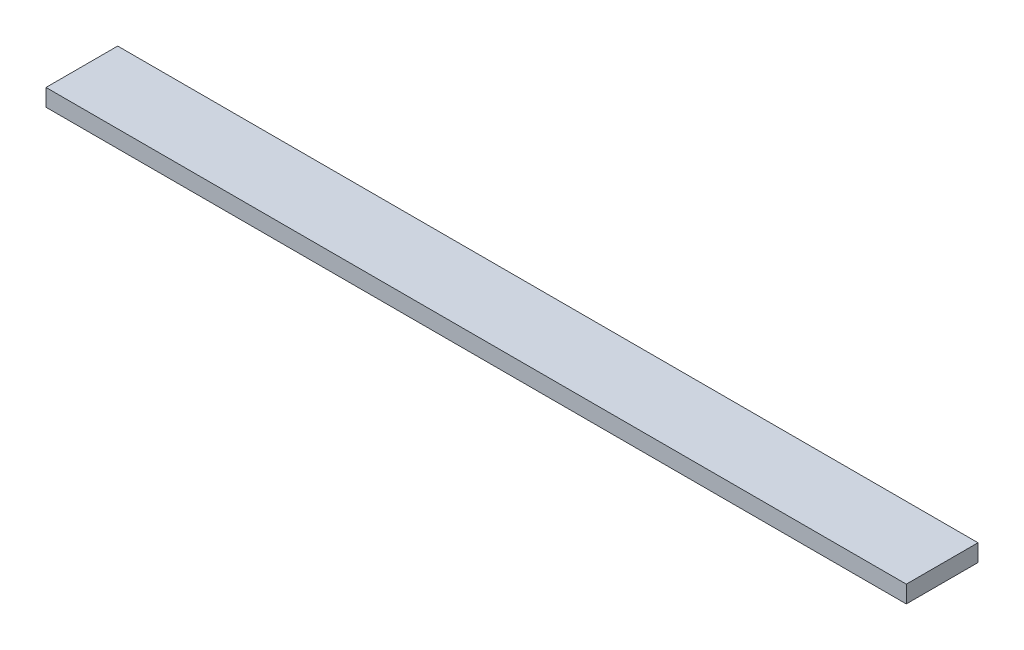
ISO-10303-21;
HEADER;
FILE_DESCRIPTION(('STEP AP214'),'2;1');
FILE_NAME('part.step','',(''),(''),'','','');
FILE_SCHEMA(('AUTOMOTIVE_DESIGN { 1 0 10303 214 1 1 1 1 }'));
ENDSEC;
DATA;
#1=APPLICATION_CONTEXT('core data for automotive mechanical design processes');
#2=APPLICATION_PROTOCOL_DEFINITION('international standard','automotive_design',2000,#1);
#3=PRODUCT_CONTEXT('',#1,'mechanical');
#4=PRODUCT('Part','Part','',(#3));
#5=PRODUCT_RELATED_PRODUCT_CATEGORY('part','',(#4));
#6=PRODUCT_DEFINITION_FORMATION('','',#4);
#7=PRODUCT_DEFINITION_CONTEXT('part definition',#1,'design');
#8=PRODUCT_DEFINITION('design','',#6,#7);
#9=PRODUCT_DEFINITION_SHAPE('','',#8);
#10=(LENGTH_UNIT() NAMED_UNIT(*) SI_UNIT(.MILLI.,.METRE.));
#11=(NAMED_UNIT(*) PLANE_ANGLE_UNIT() SI_UNIT($,.RADIAN.));
#12=(NAMED_UNIT(*) SI_UNIT($,.STERADIAN.) SOLID_ANGLE_UNIT());
#13=UNCERTAINTY_MEASURE_WITH_UNIT(LENGTH_MEASURE(1.E-05),#10,'distance_accuracy_value','');
#14=(GEOMETRIC_REPRESENTATION_CONTEXT(3) GLOBAL_UNCERTAINTY_ASSIGNED_CONTEXT((#13)) GLOBAL_UNIT_ASSIGNED_CONTEXT((#10,
#11,#12)) REPRESENTATION_CONTEXT('',''));
#15=CARTESIAN_POINT('',(0.,0.,0.));
#16=DIRECTION('',(0.,0.,1.));
#17=DIRECTION('',(1.,0.,0.));
#18=AXIS2_PLACEMENT_3D('',#15,#16,#17);
#19=CARTESIAN_POINT('',(457.2,18.25625,38.1));
#20=DIRECTION('',(-1.,0.,0.));
#21=DIRECTION('',(0.,0.,1.));
#22=AXIS2_PLACEMENT_3D('',#19,#20,#21);
#23=PLANE('',#22);
#24=DIRECTION('',(0.,0.,-1.));
#25=VECTOR('',#24,1.);
#26=CARTESIAN_POINT('',(457.2,0.,38.1));
#27=LINE('',#26,#25);
#28=CARTESIAN_POINT('',(457.2,0.,38.1));
#29=VERTEX_POINT('',#28);
#30=CARTESIAN_POINT('',(457.2,0.,-38.1));
#31=VERTEX_POINT('',#30);
#32=EDGE_CURVE('E107',#29,#31,#27,.T.);
#33=ORIENTED_EDGE('',*,*,#32,.T.);
#34=DIRECTION('',(0.,-1.,0.));
#35=VECTOR('',#34,1.);
#36=CARTESIAN_POINT('',(457.2,18.25625,-38.1));
#37=LINE('',#36,#35);
#38=CARTESIAN_POINT('',(457.2,18.25625,-38.1));
#39=VERTEX_POINT('',#38);
#40=EDGE_CURVE('E11',#39,#31,#37,.T.);
#41=ORIENTED_EDGE('',*,*,#40,.F.);
#42=DIRECTION('',(0.,0.,-1.));
#43=VECTOR('',#42,1.);
#44=CARTESIAN_POINT('',(457.2,18.25625,38.1));
#45=LINE('',#44,#43);
#46=CARTESIAN_POINT('',(457.2,18.25625,38.1));
#47=VERTEX_POINT('',#46);
#48=EDGE_CURVE('E91',#47,#39,#45,.T.);
#49=ORIENTED_EDGE('',*,*,#48,.F.);
#50=DIRECTION('',(0.,-1.,0.));
#51=VECTOR('',#50,1.);
#52=CARTESIAN_POINT('',(457.2,18.25625,38.1));
#53=LINE('',#52,#51);
#54=EDGE_CURVE('E103',#47,#29,#53,.T.);
#55=ORIENTED_EDGE('',*,*,#54,.T.);
#56=EDGE_LOOP('',(#33,#41,#49,#55));
#57=FACE_BOUND('',#56,.T.);
#58=ADVANCED_FACE('F39',(#57),#23,.F.);
#59=CARTESIAN_POINT('',(-457.2,18.25625,-38.1));
#60=DIRECTION('',(0.,0.,1.));
#61=DIRECTION('',(1.,0.,0.));
#62=AXIS2_PLACEMENT_3D('',#59,#60,#61);
#63=PLANE('',#62);
#64=DIRECTION('',(-1.,0.,0.));
#65=VECTOR('',#64,1.);
#66=CARTESIAN_POINT('',(-457.2,0.,-38.1));
#67=LINE('',#66,#65);
#68=CARTESIAN_POINT('',(-457.2,0.,-38.1));
#69=VERTEX_POINT('',#68);
#70=EDGE_CURVE('E96',#31,#69,#67,.T.);
#71=ORIENTED_EDGE('',*,*,#70,.T.);
#72=DIRECTION('',(0.,-1.,0.));
#73=VECTOR('',#72,1.);
#74=CARTESIAN_POINT('',(-457.2,18.25625,-38.1));
#75=LINE('',#74,#73);
#76=CARTESIAN_POINT('',(-457.2,18.25625,-38.1));
#77=VERTEX_POINT('',#76);
#78=EDGE_CURVE('E48',#77,#69,#75,.T.);
#79=ORIENTED_EDGE('',*,*,#78,.F.);
#80=DIRECTION('',(-1.,0.,0.));
#81=VECTOR('',#80,1.);
#82=CARTESIAN_POINT('',(-457.2,18.25625,-38.1));
#83=LINE('',#82,#81);
#84=EDGE_CURVE('E86',#39,#77,#83,.T.);
#85=ORIENTED_EDGE('',*,*,#84,.F.);
#86=ORIENTED_EDGE('',*,*,#40,.T.);
#87=EDGE_LOOP('',(#71,#79,#85,#86));
#88=FACE_BOUND('',#87,.T.);
#89=ADVANCED_FACE('F95',(#88),#63,.F.);
#90=CARTESIAN_POINT('',(-457.2,18.25625,38.1));
#91=DIRECTION('',(1.,0.,0.));
#92=DIRECTION('',(0.,0.,-1.));
#93=AXIS2_PLACEMENT_3D('',#90,#91,#92);
#94=PLANE('',#93);
#95=DIRECTION('',(0.,0.,1.));
#96=VECTOR('',#95,1.);
#97=CARTESIAN_POINT('',(-457.2,0.,38.1));
#98=LINE('',#97,#96);
#99=CARTESIAN_POINT('',(-457.2,0.,38.1));
#100=VERTEX_POINT('',#99);
#101=EDGE_CURVE('E73',#69,#100,#98,.T.);
#102=ORIENTED_EDGE('',*,*,#101,.T.);
#103=DIRECTION('',(0.,-1.,0.));
#104=VECTOR('',#103,1.);
#105=CARTESIAN_POINT('',(-457.2,18.25625,38.1));
#106=LINE('',#105,#104);
#107=CARTESIAN_POINT('',(-457.2,18.25625,38.1));
#108=VERTEX_POINT('',#107);
#109=EDGE_CURVE('E98',#108,#100,#106,.T.);
#110=ORIENTED_EDGE('',*,*,#109,.F.);
#111=DIRECTION('',(0.,0.,1.));
#112=VECTOR('',#111,1.);
#113=CARTESIAN_POINT('',(-457.2,18.25625,38.1));
#114=LINE('',#113,#112);
#115=EDGE_CURVE('E89',#77,#108,#114,.T.);
#116=ORIENTED_EDGE('',*,*,#115,.F.);
#117=ORIENTED_EDGE('',*,*,#78,.T.);
#118=EDGE_LOOP('',(#102,#110,#116,#117));
#119=FACE_BOUND('',#118,.T.);
#120=ADVANCED_FACE('F99',(#119),#94,.F.);
#121=CARTESIAN_POINT('',(-457.2,18.25625,38.1));
#122=DIRECTION('',(0.,0.,-1.));
#123=DIRECTION('',(-1.,0.,0.));
#124=AXIS2_PLACEMENT_3D('',#121,#122,#123);
#125=PLANE('',#124);
#126=DIRECTION('',(1.,0.,0.));
#127=VECTOR('',#126,1.);
#128=CARTESIAN_POINT('',(-457.2,0.,38.1));
#129=LINE('',#128,#127);
#130=EDGE_CURVE('E79',#100,#29,#129,.T.);
#131=ORIENTED_EDGE('',*,*,#130,.T.);
#132=ORIENTED_EDGE('',*,*,#54,.F.);
#133=DIRECTION('',(1.,0.,0.));
#134=VECTOR('',#133,1.);
#135=CARTESIAN_POINT('',(-457.2,18.25625,38.1));
#136=LINE('',#135,#134);
#137=EDGE_CURVE('E56',#108,#47,#136,.T.);
#138=ORIENTED_EDGE('',*,*,#137,.F.);
#139=ORIENTED_EDGE('',*,*,#109,.T.);
#140=EDGE_LOOP('',(#131,#132,#138,#139));
#141=FACE_BOUND('',#140,.T.);
#142=ADVANCED_FACE('F120',(#141),#125,.F.);
#143=CARTESIAN_POINT('',(0.,18.25625,0.));
#144=DIRECTION('',(0.,-1.,0.));
#145=DIRECTION('',(0.,0.,-1.));
#146=AXIS2_PLACEMENT_3D('',#143,#144,#145);
#147=PLANE('',#146);
#148=ORIENTED_EDGE('',*,*,#48,.T.);
#149=ORIENTED_EDGE('',*,*,#84,.T.);
#150=ORIENTED_EDGE('',*,*,#115,.T.);
#151=ORIENTED_EDGE('',*,*,#137,.T.);
#152=EDGE_LOOP('',(#148,#149,#150,#151));
#153=FACE_BOUND('',#152,.T.);
#154=ADVANCED_FACE('F87',(#153),#147,.F.);
#155=CARTESIAN_POINT('',(0.,0.,0.));
#156=DIRECTION('',(0.,-1.,0.));
#157=DIRECTION('',(0.,0.,-1.));
#158=AXIS2_PLACEMENT_3D('',#155,#156,#157);
#159=PLANE('',#158);
#160=ORIENTED_EDGE('',*,*,#32,.F.);
#161=ORIENTED_EDGE('',*,*,#130,.F.);
#162=ORIENTED_EDGE('',*,*,#101,.F.);
#163=ORIENTED_EDGE('',*,*,#70,.F.);
#164=EDGE_LOOP('',(#160,#161,#162,#163));
#165=FACE_BOUND('',#164,.T.);
#166=ADVANCED_FACE('F123',(#165),#159,.T.);
#167=CLOSED_SHELL('',(#58,#89,#120,#142,#154,#166));
#168=MANIFOLD_SOLID_BREP('B2',#167);
#169=ADVANCED_BREP_SHAPE_REPRESENTATION('',(#18,#168),#14);
#170=SHAPE_DEFINITION_REPRESENTATION(#9,#169);
ENDSEC;
END-ISO-10303-21;
